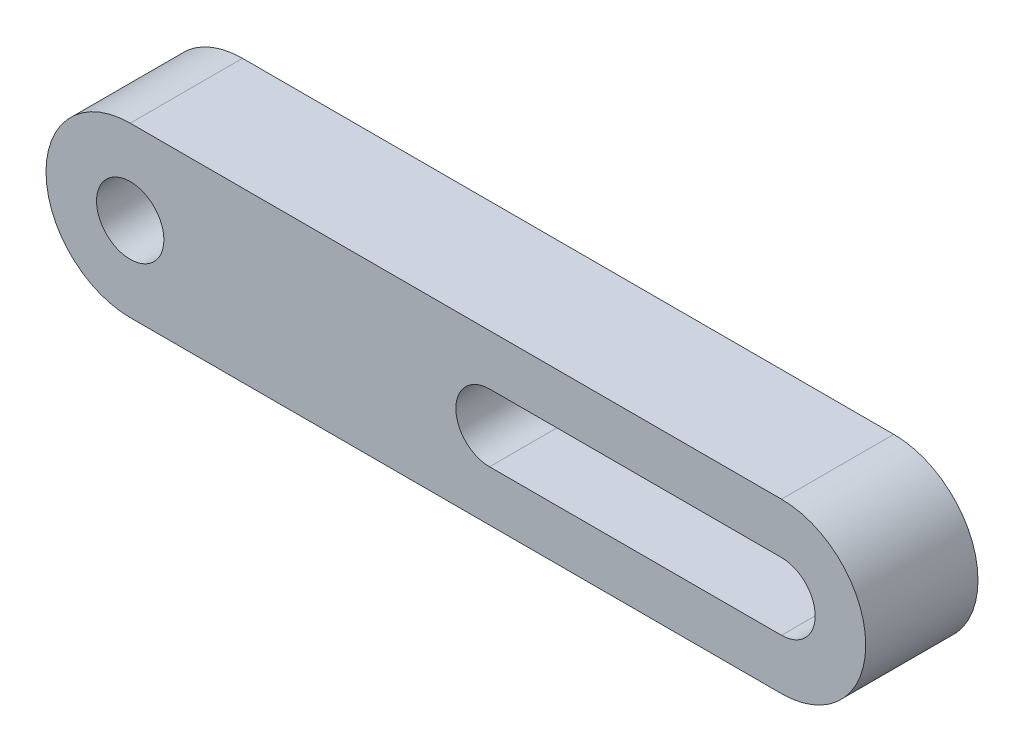
ISO-10303-21;
HEADER;
FILE_DESCRIPTION(('STEP AP214'),'2;1');
FILE_NAME('part.step','',(''),(''),'','','');
FILE_SCHEMA(('AUTOMOTIVE_DESIGN { 1 0 10303 214 1 1 1 1 }'));
ENDSEC;
DATA;
#1=APPLICATION_CONTEXT('core data for automotive mechanical design processes');
#2=APPLICATION_PROTOCOL_DEFINITION('international standard','automotive_design',2000,#1);
#3=PRODUCT_CONTEXT('',#1,'mechanical');
#4=PRODUCT('Part','Part','',(#3));
#5=PRODUCT_RELATED_PRODUCT_CATEGORY('part','',(#4));
#6=PRODUCT_DEFINITION_FORMATION('','',#4);
#7=PRODUCT_DEFINITION_CONTEXT('part definition',#1,'design');
#8=PRODUCT_DEFINITION('design','',#6,#7);
#9=PRODUCT_DEFINITION_SHAPE('','',#8);
#10=(LENGTH_UNIT() NAMED_UNIT(*) SI_UNIT(.MILLI.,.METRE.));
#11=(NAMED_UNIT(*) PLANE_ANGLE_UNIT() SI_UNIT($,.RADIAN.));
#12=(NAMED_UNIT(*) SI_UNIT($,.STERADIAN.) SOLID_ANGLE_UNIT());
#13=UNCERTAINTY_MEASURE_WITH_UNIT(LENGTH_MEASURE(1.E-05),#10,'distance_accuracy_value','');
#14=(GEOMETRIC_REPRESENTATION_CONTEXT(3) GLOBAL_UNCERTAINTY_ASSIGNED_CONTEXT((#13)) GLOBAL_UNIT_ASSIGNED_CONTEXT((#10,
#11,#12)) REPRESENTATION_CONTEXT('',''));
#15=CARTESIAN_POINT('',(0.,0.,0.));
#16=DIRECTION('',(0.,0.,1.));
#17=DIRECTION('',(1.,0.,0.));
#18=AXIS2_PLACEMENT_3D('',#15,#16,#17);
#19=CARTESIAN_POINT('',(0.,0.,5.));
#20=DIRECTION('',(0.,0.,1.));
#21=DIRECTION('',(1.,0.,0.));
#22=AXIS2_PLACEMENT_3D('',#19,#20,#21);
#23=PLANE('',#22);
#24=CARTESIAN_POINT('',(0.,0.,5.));
#25=DIRECTION('',(0.,0.,1.));
#26=DIRECTION('',(1.,0.,0.));
#27=AXIS2_PLACEMENT_3D('',#24,#25,#26);
#28=CIRCLE('',#27,1.5);
#29=CARTESIAN_POINT('',(1.5,0.,5.));
#30=VERTEX_POINT('',#29);
#31=EDGE_CURVE('E133',#30,#30,#28,.T.);
#32=ORIENTED_EDGE('',*,*,#31,.F.);
#33=EDGE_LOOP('',(#32));
#34=FACE_BOUND('',#33,.T.);
#35=CARTESIAN_POINT('',(0.,0.,5.));
#36=DIRECTION('',(0.,0.,1.));
#37=DIRECTION('',(1.,0.,0.));
#38=AXIS2_PLACEMENT_3D('',#35,#36,#37);
#39=CIRCLE('',#38,3.75);
#40=CARTESIAN_POINT('',(0.,3.75,5.));
#41=VERTEX_POINT('',#40);
#42=CARTESIAN_POINT('',(0.,-3.75,5.));
#43=VERTEX_POINT('',#42);
#44=EDGE_CURVE('E139',#41,#43,#39,.T.);
#45=ORIENTED_EDGE('',*,*,#44,.T.);
#46=DIRECTION('',(1.,0.,0.));
#47=VECTOR('',#46,1.);
#48=CARTESIAN_POINT('',(0.,-3.75,5.));
#49=LINE('',#48,#47);
#50=CARTESIAN_POINT('',(29.,-3.75,5.));
#51=VERTEX_POINT('',#50);
#52=EDGE_CURVE('E142',#43,#51,#49,.T.);
#53=ORIENTED_EDGE('',*,*,#52,.T.);
#54=CARTESIAN_POINT('',(29.,0.,5.));
#55=DIRECTION('',(0.,0.,1.));
#56=DIRECTION('',(1.,0.,0.));
#57=AXIS2_PLACEMENT_3D('',#54,#55,#56);
#58=CIRCLE('',#57,3.75);
#59=CARTESIAN_POINT('',(29.,3.75,5.));
#60=VERTEX_POINT('',#59);
#61=EDGE_CURVE('E145',#51,#60,#58,.T.);
#62=ORIENTED_EDGE('',*,*,#61,.T.);
#63=DIRECTION('',(-1.,0.,0.));
#64=VECTOR('',#63,1.);
#65=CARTESIAN_POINT('',(0.,3.75,5.));
#66=LINE('',#65,#64);
#67=EDGE_CURVE('E147',#60,#41,#66,.T.);
#68=ORIENTED_EDGE('',*,*,#67,.T.);
#69=EDGE_LOOP('',(#45,#53,#62,#68));
#70=FACE_BOUND('',#69,.T.);
#71=DIRECTION('',(-1.,0.,0.));
#72=VECTOR('',#71,1.);
#73=CARTESIAN_POINT('',(29.,1.5,5.));
#74=LINE('',#73,#72);
#75=CARTESIAN_POINT('',(29.,1.5,5.));
#76=VERTEX_POINT('',#75);
#77=CARTESIAN_POINT('',(16.,1.5,5.));
#78=VERTEX_POINT('',#77);
#79=EDGE_CURVE('E105',#76,#78,#74,.T.);
#80=ORIENTED_EDGE('',*,*,#79,.F.);
#81=CARTESIAN_POINT('',(29.,0.,5.));
#82=DIRECTION('',(0.,0.,1.));
#83=DIRECTION('',(1.,0.,0.));
#84=AXIS2_PLACEMENT_3D('',#81,#82,#83);
#85=CIRCLE('',#84,1.5);
#86=CARTESIAN_POINT('',(29.,-1.5,5.));
#87=VERTEX_POINT('',#86);
#88=EDGE_CURVE('E97',#87,#76,#85,.T.);
#89=ORIENTED_EDGE('',*,*,#88,.F.);
#90=DIRECTION('',(1.,0.,0.));
#91=VECTOR('',#90,1.);
#92=CARTESIAN_POINT('',(29.,-1.5,5.));
#93=LINE('',#92,#91);
#94=CARTESIAN_POINT('',(16.,-1.5,5.));
#95=VERTEX_POINT('',#94);
#96=EDGE_CURVE('E119',#95,#87,#93,.T.);
#97=ORIENTED_EDGE('',*,*,#96,.F.);
#98=CARTESIAN_POINT('',(16.,0.,5.));
#99=DIRECTION('',(0.,0.,1.));
#100=DIRECTION('',(1.,0.,0.));
#101=AXIS2_PLACEMENT_3D('',#98,#99,#100);
#102=CIRCLE('',#101,1.5);
#103=EDGE_CURVE('E117',#78,#95,#102,.T.);
#104=ORIENTED_EDGE('',*,*,#103,.F.);
#105=EDGE_LOOP('',(#80,#89,#97,#104));
#106=FACE_BOUND('',#105,.T.);
#107=ADVANCED_FACE('F32',(#34,#70,#106),#23,.T.);
#108=CARTESIAN_POINT('',(0.,0.,0.));
#109=DIRECTION('',(0.,0.,1.));
#110=DIRECTION('',(1.,0.,0.));
#111=AXIS2_PLACEMENT_3D('',#108,#109,#110);
#112=PLANE('',#111);
#113=CARTESIAN_POINT('',(0.,0.,0.));
#114=DIRECTION('',(0.,0.,1.));
#115=DIRECTION('',(1.,0.,0.));
#116=AXIS2_PLACEMENT_3D('',#113,#114,#115);
#117=CIRCLE('',#116,1.5);
#118=CARTESIAN_POINT('',(1.5,0.,0.));
#119=VERTEX_POINT('',#118);
#120=EDGE_CURVE('E113',#119,#119,#117,.T.);
#121=ORIENTED_EDGE('',*,*,#120,.T.);
#122=EDGE_LOOP('',(#121));
#123=FACE_BOUND('',#122,.T.);
#124=CARTESIAN_POINT('',(0.,0.,0.));
#125=DIRECTION('',(0.,0.,1.));
#126=DIRECTION('',(1.,0.,0.));
#127=AXIS2_PLACEMENT_3D('',#124,#125,#126);
#128=CIRCLE('',#127,3.75);
#129=CARTESIAN_POINT('',(0.,3.75,0.));
#130=VERTEX_POINT('',#129);
#131=CARTESIAN_POINT('',(0.,-3.75,0.));
#132=VERTEX_POINT('',#131);
#133=EDGE_CURVE('E136',#130,#132,#128,.T.);
#134=ORIENTED_EDGE('',*,*,#133,.F.);
#135=DIRECTION('',(-1.,0.,0.));
#136=VECTOR('',#135,1.);
#137=CARTESIAN_POINT('',(0.,3.75,0.));
#138=LINE('',#137,#136);
#139=CARTESIAN_POINT('',(29.,3.75,0.));
#140=VERTEX_POINT('',#139);
#141=EDGE_CURVE('E143',#140,#130,#138,.T.);
#142=ORIENTED_EDGE('',*,*,#141,.F.);
#143=CARTESIAN_POINT('',(29.,0.,0.));
#144=DIRECTION('',(0.,0.,1.));
#145=DIRECTION('',(1.,0.,0.));
#146=AXIS2_PLACEMENT_3D('',#143,#144,#145);
#147=CIRCLE('',#146,3.75);
#148=CARTESIAN_POINT('',(29.,-3.75,0.));
#149=VERTEX_POINT('',#148);
#150=EDGE_CURVE('E154',#149,#140,#147,.T.);
#151=ORIENTED_EDGE('',*,*,#150,.F.);
#152=DIRECTION('',(1.,0.,0.));
#153=VECTOR('',#152,1.);
#154=CARTESIAN_POINT('',(0.,-3.75,0.));
#155=LINE('',#154,#153);
#156=EDGE_CURVE('E152',#132,#149,#155,.T.);
#157=ORIENTED_EDGE('',*,*,#156,.F.);
#158=EDGE_LOOP('',(#134,#142,#151,#157));
#159=FACE_BOUND('',#158,.T.);
#160=CARTESIAN_POINT('',(29.,0.,0.));
#161=DIRECTION('',(0.,0.,1.));
#162=DIRECTION('',(1.,0.,0.));
#163=AXIS2_PLACEMENT_3D('',#160,#161,#162);
#164=CIRCLE('',#163,1.5);
#165=CARTESIAN_POINT('',(29.,-1.5,0.));
#166=VERTEX_POINT('',#165);
#167=CARTESIAN_POINT('',(29.,1.5,0.));
#168=VERTEX_POINT('',#167);
#169=EDGE_CURVE('E55',#166,#168,#164,.T.);
#170=ORIENTED_EDGE('',*,*,#169,.T.);
#171=DIRECTION('',(-1.,0.,0.));
#172=VECTOR('',#171,1.);
#173=CARTESIAN_POINT('',(29.,1.5,0.));
#174=LINE('',#173,#172);
#175=CARTESIAN_POINT('',(16.,1.5,0.));
#176=VERTEX_POINT('',#175);
#177=EDGE_CURVE('E112',#168,#176,#174,.T.);
#178=ORIENTED_EDGE('',*,*,#177,.T.);
#179=CARTESIAN_POINT('',(16.,0.,0.));
#180=DIRECTION('',(0.,0.,1.));
#181=DIRECTION('',(1.,0.,0.));
#182=AXIS2_PLACEMENT_3D('',#179,#180,#181);
#183=CIRCLE('',#182,1.5);
#184=CARTESIAN_POINT('',(16.,-1.5,0.));
#185=VERTEX_POINT('',#184);
#186=EDGE_CURVE('E125',#176,#185,#183,.T.);
#187=ORIENTED_EDGE('',*,*,#186,.T.);
#188=DIRECTION('',(1.,0.,0.));
#189=VECTOR('',#188,1.);
#190=CARTESIAN_POINT('',(29.,-1.5,0.));
#191=LINE('',#190,#189);
#192=EDGE_CURVE('E106',#185,#166,#191,.T.);
#193=ORIENTED_EDGE('',*,*,#192,.T.);
#194=EDGE_LOOP('',(#170,#178,#187,#193));
#195=FACE_BOUND('',#194,.T.);
#196=ADVANCED_FACE('F172',(#123,#159,#195),#112,.F.);
#197=CARTESIAN_POINT('',(0.,0.,5.));
#198=DIRECTION('',(0.,0.,-1.));
#199=DIRECTION('',(-1.,0.,0.));
#200=AXIS2_PLACEMENT_3D('',#197,#198,#199);
#201=CYLINDRICAL_SURFACE('',#200,3.75);
#202=ORIENTED_EDGE('',*,*,#133,.T.);
#203=DIRECTION('',(0.,0.,-1.));
#204=VECTOR('',#203,1.);
#205=CARTESIAN_POINT('',(0.,-3.75,5.));
#206=LINE('',#205,#204);
#207=EDGE_CURVE('E11',#43,#132,#206,.T.);
#208=ORIENTED_EDGE('',*,*,#207,.F.);
#209=ORIENTED_EDGE('',*,*,#44,.F.);
#210=DIRECTION('',(0.,0.,-1.));
#211=VECTOR('',#210,1.);
#212=CARTESIAN_POINT('',(0.,3.75,5.));
#213=LINE('',#212,#211);
#214=EDGE_CURVE('E149',#41,#130,#213,.T.);
#215=ORIENTED_EDGE('',*,*,#214,.T.);
#216=EDGE_LOOP('',(#202,#208,#209,#215));
#217=FACE_BOUND('',#216,.T.);
#218=ADVANCED_FACE('F34',(#217),#201,.T.);
#219=CARTESIAN_POINT('',(0.,-3.75,5.));
#220=DIRECTION('',(0.,1.,0.));
#221=DIRECTION('',(0.,0.,1.));
#222=AXIS2_PLACEMENT_3D('',#219,#220,#221);
#223=PLANE('',#222);
#224=ORIENTED_EDGE('',*,*,#156,.T.);
#225=DIRECTION('',(0.,0.,-1.));
#226=VECTOR('',#225,1.);
#227=CARTESIAN_POINT('',(29.,-3.75,5.));
#228=LINE('',#227,#226);
#229=EDGE_CURVE('E40',#51,#149,#228,.T.);
#230=ORIENTED_EDGE('',*,*,#229,.F.);
#231=ORIENTED_EDGE('',*,*,#52,.F.);
#232=ORIENTED_EDGE('',*,*,#207,.T.);
#233=EDGE_LOOP('',(#224,#230,#231,#232));
#234=FACE_BOUND('',#233,.T.);
#235=ADVANCED_FACE('F182',(#234),#223,.F.);
#236=CARTESIAN_POINT('',(29.,0.,5.));
#237=DIRECTION('',(0.,0.,-1.));
#238=DIRECTION('',(-1.,0.,0.));
#239=AXIS2_PLACEMENT_3D('',#236,#237,#238);
#240=CYLINDRICAL_SURFACE('',#239,3.75);
#241=ORIENTED_EDGE('',*,*,#150,.T.);
#242=DIRECTION('',(0.,0.,-1.));
#243=VECTOR('',#242,1.);
#244=CARTESIAN_POINT('',(29.,3.75,5.));
#245=LINE('',#244,#243);
#246=EDGE_CURVE('E159',#60,#140,#245,.T.);
#247=ORIENTED_EDGE('',*,*,#246,.F.);
#248=ORIENTED_EDGE('',*,*,#61,.F.);
#249=ORIENTED_EDGE('',*,*,#229,.T.);
#250=EDGE_LOOP('',(#241,#247,#248,#249));
#251=FACE_BOUND('',#250,.T.);
#252=ADVANCED_FACE('F166',(#251),#240,.T.);
#253=CARTESIAN_POINT('',(0.,3.75,5.));
#254=DIRECTION('',(0.,-1.,0.));
#255=DIRECTION('',(0.,0.,-1.));
#256=AXIS2_PLACEMENT_3D('',#253,#254,#255);
#257=PLANE('',#256);
#258=ORIENTED_EDGE('',*,*,#141,.T.);
#259=ORIENTED_EDGE('',*,*,#214,.F.);
#260=ORIENTED_EDGE('',*,*,#67,.F.);
#261=ORIENTED_EDGE('',*,*,#246,.T.);
#262=EDGE_LOOP('',(#258,#259,#260,#261));
#263=FACE_BOUND('',#262,.T.);
#264=ADVANCED_FACE('F176',(#263),#257,.F.);
#265=CARTESIAN_POINT('',(0.,0.,5.));
#266=DIRECTION('',(0.,0.,-1.));
#267=DIRECTION('',(-1.,0.,0.));
#268=AXIS2_PLACEMENT_3D('',#265,#266,#267);
#269=CYLINDRICAL_SURFACE('',#268,1.5);
#270=ORIENTED_EDGE('',*,*,#31,.T.);
#271=EDGE_LOOP('',(#270));
#272=FACE_BOUND('',#271,.T.);
#273=ORIENTED_EDGE('',*,*,#120,.F.);
#274=EDGE_LOOP('',(#273));
#275=FACE_BOUND('',#274,.T.);
#276=ADVANCED_FACE('F199',(#272,#275),#269,.F.);
#277=CARTESIAN_POINT('',(29.,0.,5.));
#278=DIRECTION('',(0.,0.,-1.));
#279=DIRECTION('',(-1.,0.,0.));
#280=AXIS2_PLACEMENT_3D('',#277,#278,#279);
#281=CYLINDRICAL_SURFACE('',#280,1.5);
#282=ORIENTED_EDGE('',*,*,#169,.F.);
#283=DIRECTION('',(0.,0.,-1.));
#284=VECTOR('',#283,1.);
#285=CARTESIAN_POINT('',(29.,-1.5,5.));
#286=LINE('',#285,#284);
#287=EDGE_CURVE('E101',#87,#166,#286,.T.);
#288=ORIENTED_EDGE('',*,*,#287,.F.);
#289=ORIENTED_EDGE('',*,*,#88,.T.);
#290=DIRECTION('',(0.,0.,-1.));
#291=VECTOR('',#290,1.);
#292=CARTESIAN_POINT('',(29.,1.5,5.));
#293=LINE('',#292,#291);
#294=EDGE_CURVE('E100',#76,#168,#293,.T.);
#295=ORIENTED_EDGE('',*,*,#294,.T.);
#296=EDGE_LOOP('',(#282,#288,#289,#295));
#297=FACE_BOUND('',#296,.T.);
#298=ADVANCED_FACE('F99',(#297),#281,.F.);
#299=CARTESIAN_POINT('',(29.,1.5,5.));
#300=DIRECTION('',(0.,-1.,0.));
#301=DIRECTION('',(1.,0.,0.));
#302=AXIS2_PLACEMENT_3D('',#299,#300,#301);
#303=PLANE('',#302);
#304=ORIENTED_EDGE('',*,*,#177,.F.);
#305=ORIENTED_EDGE('',*,*,#294,.F.);
#306=ORIENTED_EDGE('',*,*,#79,.T.);
#307=DIRECTION('',(0.,0.,-1.));
#308=VECTOR('',#307,1.);
#309=CARTESIAN_POINT('',(16.,1.5,5.));
#310=LINE('',#309,#308);
#311=EDGE_CURVE('E114',#78,#176,#310,.T.);
#312=ORIENTED_EDGE('',*,*,#311,.T.);
#313=EDGE_LOOP('',(#304,#305,#306,#312));
#314=FACE_BOUND('',#313,.T.);
#315=ADVANCED_FACE('F109',(#314),#303,.T.);
#316=CARTESIAN_POINT('',(16.,0.,5.));
#317=DIRECTION('',(0.,0.,-1.));
#318=DIRECTION('',(-1.,0.,0.));
#319=AXIS2_PLACEMENT_3D('',#316,#317,#318);
#320=CYLINDRICAL_SURFACE('',#319,1.5);
#321=ORIENTED_EDGE('',*,*,#186,.F.);
#322=ORIENTED_EDGE('',*,*,#311,.F.);
#323=ORIENTED_EDGE('',*,*,#103,.T.);
#324=DIRECTION('',(0.,0.,-1.));
#325=VECTOR('',#324,1.);
#326=CARTESIAN_POINT('',(16.,-1.5,5.));
#327=LINE('',#326,#325);
#328=EDGE_CURVE('E47',#95,#185,#327,.T.);
#329=ORIENTED_EDGE('',*,*,#328,.T.);
#330=EDGE_LOOP('',(#321,#322,#323,#329));
#331=FACE_BOUND('',#330,.T.);
#332=ADVANCED_FACE('F215',(#331),#320,.F.);
#333=CARTESIAN_POINT('',(29.,-1.5,5.));
#334=DIRECTION('',(0.,1.,0.));
#335=DIRECTION('',(-1.,0.,0.));
#336=AXIS2_PLACEMENT_3D('',#333,#334,#335);
#337=PLANE('',#336);
#338=ORIENTED_EDGE('',*,*,#192,.F.);
#339=ORIENTED_EDGE('',*,*,#328,.F.);
#340=ORIENTED_EDGE('',*,*,#96,.T.);
#341=ORIENTED_EDGE('',*,*,#287,.T.);
#342=EDGE_LOOP('',(#338,#339,#340,#341));
#343=FACE_BOUND('',#342,.T.);
#344=ADVANCED_FACE('F220',(#343),#337,.T.);
#345=CLOSED_SHELL('',(#107,#196,#218,#235,#252,#264,#276,#298,#315,#332,#344));
#346=MANIFOLD_SOLID_BREP('B2',#345);
#347=ADVANCED_BREP_SHAPE_REPRESENTATION('',(#18,#346),#14);
#348=SHAPE_DEFINITION_REPRESENTATION(#9,#347);
ENDSEC;
END-ISO-10303-21;
